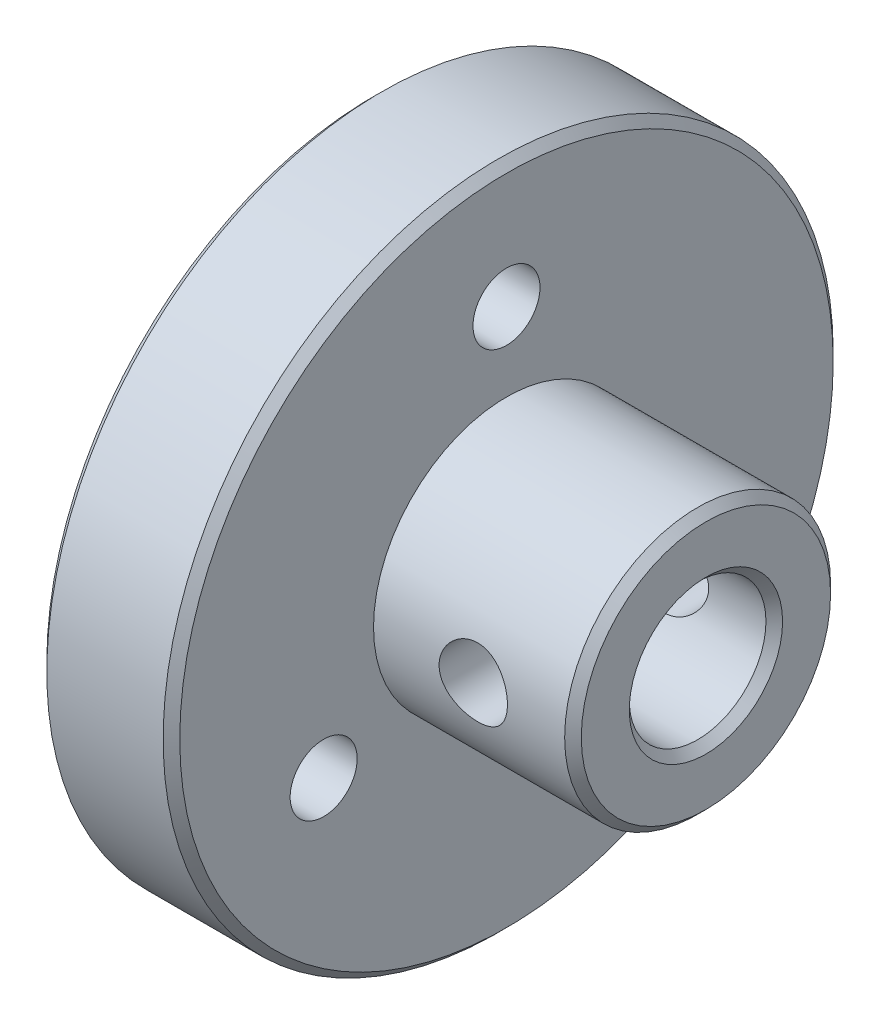
ISO-10303-21;
HEADER;
FILE_DESCRIPTION(('STEP AP214'),'2;1');
FILE_NAME('part.step','',(''),(''),'','','');
FILE_SCHEMA(('AUTOMOTIVE_DESIGN { 1 0 10303 214 1 1 1 1 }'));
ENDSEC;
DATA;
#1=APPLICATION_CONTEXT('core data for automotive mechanical design processes');
#2=APPLICATION_PROTOCOL_DEFINITION('international standard','automotive_design',2000,#1);
#3=PRODUCT_CONTEXT('',#1,'mechanical');
#4=PRODUCT('Part','Part','',(#3));
#5=PRODUCT_RELATED_PRODUCT_CATEGORY('part','',(#4));
#6=PRODUCT_DEFINITION_FORMATION('','',#4);
#7=PRODUCT_DEFINITION_CONTEXT('part definition',#1,'design');
#8=PRODUCT_DEFINITION('design','',#6,#7);
#9=PRODUCT_DEFINITION_SHAPE('','',#8);
#10=(LENGTH_UNIT() NAMED_UNIT(*) SI_UNIT(.MILLI.,.METRE.));
#11=(NAMED_UNIT(*) PLANE_ANGLE_UNIT() SI_UNIT($,.RADIAN.));
#12=(NAMED_UNIT(*) SI_UNIT($,.STERADIAN.) SOLID_ANGLE_UNIT());
#13=UNCERTAINTY_MEASURE_WITH_UNIT(LENGTH_MEASURE(1.E-05),#10,'distance_accuracy_value','');
#14=(GEOMETRIC_REPRESENTATION_CONTEXT(3) GLOBAL_UNCERTAINTY_ASSIGNED_CONTEXT((#13)) GLOBAL_UNIT_ASSIGNED_CONTEXT((#10,
#11,#12)) REPRESENTATION_CONTEXT('',''));
#15=CARTESIAN_POINT('',(0.,0.,0.));
#16=DIRECTION('',(0.,0.,1.));
#17=DIRECTION('',(1.,0.,0.));
#18=AXIS2_PLACEMENT_3D('',#15,#16,#17);
#19=CARTESIAN_POINT('',(0.,0.,0.));
#20=DIRECTION('',(1.,0.,0.));
#21=DIRECTION('',(0.,0.,-1.));
#22=AXIS2_PLACEMENT_3D('',#19,#20,#21);
#23=CYLINDRICAL_SURFACE('',#22,5.);
#24=CARTESIAN_POINT('',(-15.875,0.,0.));
#25=DIRECTION('',(1.,0.,0.));
#26=DIRECTION('',(0.,0.,-1.));
#27=AXIS2_PLACEMENT_3D('',#24,#25,#26);
#28=CIRCLE('',#27,5.);
#29=CARTESIAN_POINT('',(-15.875,0.,-5.));
#30=VERTEX_POINT('',#29);
#31=EDGE_CURVE('E195',#30,#30,#28,.T.);
#32=ORIENTED_EDGE('',*,*,#31,.F.);
#33=EDGE_LOOP('',(#32));
#34=FACE_BOUND('',#33,.T.);
#35=CARTESIAN_POINT('',(-14.0716,0.,0.));
#36=DIRECTION('',(1.,0.,0.));
#37=DIRECTION('',(0.,0.,-1.));
#38=AXIS2_PLACEMENT_3D('',#35,#36,#37);
#39=CIRCLE('',#38,5.);
#40=CARTESIAN_POINT('',(-14.0716,0.,-5.));
#41=VERTEX_POINT('',#40);
#42=EDGE_CURVE('E74',#41,#41,#39,.T.);
#43=ORIENTED_EDGE('',*,*,#42,.T.);
#44=EDGE_LOOP('',(#43));
#45=FACE_BOUND('',#44,.T.);
#46=ADVANCED_FACE('F41',(#34,#45),#23,.F.);
#47=CARTESIAN_POINT('',(-14.0716,0.,0.));
#48=DIRECTION('',(1.,0.,0.));
#49=DIRECTION('',(0.,0.,-1.));
#50=AXIS2_PLACEMENT_3D('',#47,#48,#49);
#51=PLANE('',#50);
#52=ORIENTED_EDGE('',*,*,#42,.F.);
#53=EDGE_LOOP('',(#52));
#54=FACE_BOUND('',#53,.T.);
#55=CARTESIAN_POINT('',(-14.0716,0.,0.));
#56=DIRECTION('',(1.,0.,0.));
#57=DIRECTION('',(0.,0.,-1.));
#58=AXIS2_PLACEMENT_3D('',#55,#56,#57);
#59=CIRCLE('',#58,3.2639);
#60=CARTESIAN_POINT('',(-14.0716,0.,-3.2639));
#61=VERTEX_POINT('',#60);
#62=EDGE_CURVE('E194',#61,#61,#59,.T.);
#63=ORIENTED_EDGE('',*,*,#62,.T.);
#64=EDGE_LOOP('',(#63));
#65=FACE_BOUND('',#64,.T.);
#66=ADVANCED_FACE('F127',(#54,#65),#51,.F.);
#67=CARTESIAN_POINT('',(0.,0.,0.));
#68=DIRECTION('',(1.,0.,0.));
#69=DIRECTION('',(0.,0.,-1.));
#70=AXIS2_PLACEMENT_3D('',#67,#68,#69);
#71=CYLINDRICAL_SURFACE('',#70,3.2639);
#72=CARTESIAN_POINT('',(-0.396875000000003,0.,0.));
#73=DIRECTION('',(1.,0.,0.));
#74=DIRECTION('',(0.,0.,-1.));
#75=AXIS2_PLACEMENT_3D('',#72,#73,#74);
#76=CIRCLE('',#75,3.2639);
#77=CARTESIAN_POINT('',(-0.396875000000003,0.,-3.2639));
#78=VERTEX_POINT('',#77);
#79=EDGE_CURVE('E71',#78,#78,#76,.T.);
#80=ORIENTED_EDGE('',*,*,#79,.T.);
#81=EDGE_LOOP('',(#80));
#82=FACE_BOUND('',#81,.T.);
#83=CARTESIAN_POINT('',(-6.39445,0.,-3.2639));
#84=CARTESIAN_POINT('',(-6.39444461078346,-0.0857948149382654,-3.26389532291357));
#85=CARTESIAN_POINT('',(-6.38764464917009,-0.171691910376437,-3.26048091819691));
#86=CARTESIAN_POINT('',(-6.36074553192663,-0.340947377947075,-3.24715873944838));
#87=CARTESIAN_POINT('',(-6.34062111984722,-0.424300613712308,-3.23723863422405));
#88=CARTESIAN_POINT('',(-6.28805696402809,-0.585761598567648,-3.21194327172338));
#89=CARTESIAN_POINT('',(-6.25566508102653,-0.66388836205654,-3.19658922965782));
#90=CARTESIAN_POINT('',(-6.17973332446341,-0.813482386997529,-3.16183419984897));
#91=CARTESIAN_POINT('',(-6.13619432987307,-0.884950172917077,-3.14243353121231));
#92=CARTESIAN_POINT('',(-6.03620882470249,-1.02406138319655,-3.09999115664244));
#93=CARTESIAN_POINT('',(-5.97914079020487,-1.09121187179073,-3.07680018216184));
#94=CARTESIAN_POINT('',(-5.8550554719428,-1.21544281505067,-3.02987788444172));
#95=CARTESIAN_POINT('',(-5.78803067749997,-1.27251559605109,-3.00614616484334));
#96=CARTESIAN_POINT('',(-5.63970029774532,-1.37940900213483,-2.95870823406511));
#97=CARTESIAN_POINT('',(-5.55769032430439,-1.42832398635349,-2.93514672375907));
#98=CARTESIAN_POINT('',(-5.3853054260373,-1.51146023787427,-2.89321853057488));
#99=CARTESIAN_POINT('',(-5.29493653303091,-1.54569200161431,-2.87484813999227));
#100=CARTESIAN_POINT('',(-5.1139157812067,-1.59626323902967,-2.84706516112352));
#101=CARTESIAN_POINT('',(-5.02360473444862,-1.61355116246243,-2.83718214611041));
#102=CARTESIAN_POINT('',(-4.84086813568578,-1.63264683173037,-2.826241853015));
#103=CARTESIAN_POINT('',(-4.74844476392532,-1.63446987502044,-2.82517585339779));
#104=CARTESIAN_POINT('',(-4.57599092261854,-1.62327991830083,-2.83161162633316));
#105=CARTESIAN_POINT('',(-4.49580015224554,-1.61201501193612,-2.83810406858223));
#106=CARTESIAN_POINT('',(-4.33864682999867,-1.57799748666846,-2.85715651482207));
#107=CARTESIAN_POINT('',(-4.26168531491899,-1.55524120841977,-2.86971845154517));
#108=CARTESIAN_POINT('',(-4.11097801710947,-1.49847245110094,-2.89977077131773));
#109=CARTESIAN_POINT('',(-4.03734889450153,-1.46421012877995,-2.91736913671612));
#110=CARTESIAN_POINT('',(-3.89653136620774,-1.3855935821898,-2.95551700617037));
#111=CARTESIAN_POINT('',(-3.82934587285744,-1.34123482488976,-2.97606783427032));
#112=CARTESIAN_POINT('',(-3.69435404158569,-1.23712589831493,-3.02095418040267));
#113=CARTESIAN_POINT('',(-3.62754915516739,-1.17613732133575,-3.04543918030858));
#114=CARTESIAN_POINT('',(-3.50469833363058,-1.04372272672699,-3.093322438451));
#115=CARTESIAN_POINT('',(-3.44865754036031,-0.972291749466407,-3.11672017329165));
#116=CARTESIAN_POINT('',(-3.34648038548254,-0.816817911692287,-3.16111958146433));
#117=CARTESIAN_POINT('',(-3.30092480899218,-0.732343423810657,-3.18195953203188));
#118=CARTESIAN_POINT('',(-3.22504475345326,-0.555623840366944,-3.21751804095811));
#119=CARTESIAN_POINT('',(-3.1947081803645,-0.463384983186119,-3.23224145831931));
#120=CARTESIAN_POINT('',(-3.15262146490457,-0.281946276065685,-3.25287346449336));
#121=CARTESIAN_POINT('',(-3.13954002782304,-0.193127460778343,-3.25941113060823));
#122=CARTESIAN_POINT('',(-3.12815963202507,-0.0143278681373462,-3.26509154314584));
#123=CARTESIAN_POINT('',(-3.12985367037067,0.075652338576696,-3.26423779278256));
#124=CARTESIAN_POINT('',(-3.14720680516497,0.24680464863253,-3.25559651197993));
#125=CARTESIAN_POINT('',(-3.16177333678871,0.328118900967082,-3.24835152600806));
#126=CARTESIAN_POINT('',(-3.20274432142924,0.486985127892152,-3.22835892477253));
#127=CARTESIAN_POINT('',(-3.22915007952378,0.564536686663568,-3.21561070287443));
#128=CARTESIAN_POINT('',(-3.29374249729539,0.716244264559279,-3.18530939094405));
#129=CARTESIAN_POINT('',(-3.33224441423727,0.79023979639362,-3.16762934003949));
#130=CARTESIAN_POINT('',(-3.41958064279842,0.930964419225125,-3.1291657888731));
#131=CARTESIAN_POINT('',(-3.46841935595296,0.997690396363908,-3.10838096767465));
#132=CARTESIAN_POINT('',(-3.58057722611846,1.12893028053553,-3.06330431809608));
#133=CARTESIAN_POINT('',(-3.64484740415906,1.19258349239676,-3.03886853520349));
#134=CARTESIAN_POINT('',(-3.78320785062769,1.30858942324992,-2.99075059986014));
#135=CARTESIAN_POINT('',(-3.85730485550386,1.36093432491249,-2.96706897833507));
#136=CARTESIAN_POINT('',(-4.01774926142759,1.45522273103403,-2.9220259312138));
#137=CARTESIAN_POINT('',(-4.10451614570289,1.49653975787121,-2.90083240662868));
#138=CARTESIAN_POINT('',(-4.28517105477897,1.56354326778414,-2.86528107280413));
#139=CARTESIAN_POINT('',(-4.37904972741764,1.58924989094918,-2.85091446090985));
#140=CARTESIAN_POINT('',(-4.56162363823669,1.62193258086156,-2.83243691599058));
#141=CARTESIAN_POINT('',(-4.64995134989364,1.63046981548388,-2.82747386945813));
#142=CARTESIAN_POINT('',(-4.82687564125915,1.63307466548424,-2.82597200507364));
#143=CARTESIAN_POINT('',(-4.91547208779175,1.6271485527968,-2.82942953569287));
#144=CARTESIAN_POINT('',(-5.08151930032749,1.602454340662,-2.84347478974254));
#145=CARTESIAN_POINT('',(-5.15922781225271,1.58496340859211,-2.85335188040974));
#146=CARTESIAN_POINT('',(-5.31052206049459,1.53921502585433,-2.8782867986744));
#147=CARTESIAN_POINT('',(-5.38410646187509,1.51095411186843,-2.8933462926332));
#148=CARTESIAN_POINT('',(-5.53053622556748,1.44234310554326,-2.92818390128404));
#149=CARTESIAN_POINT('',(-5.60299978438988,1.40130836335833,-2.94821106164023));
#150=CARTESIAN_POINT('',(-5.740486079321,1.30907027816364,-2.9903089946151));
#151=CARTESIAN_POINT('',(-5.80550491642393,1.25786164485767,-3.01238082723747));
#152=CARTESIAN_POINT('',(-5.93447180810371,1.13943291894503,-3.05929138277848));
#153=CARTESIAN_POINT('',(-5.99732982208056,1.07102336411038,-3.08414043507252));
#154=CARTESIAN_POINT('',(-6.11091987581719,0.923936336032265,-3.13134897800594));
#155=CARTESIAN_POINT('',(-6.16164537952791,0.845253363397916,-3.15370712329019));
#156=CARTESIAN_POINT('',(-6.24959218212796,0.678779569369928,-3.19369366712111));
#157=CARTESIAN_POINT('',(-6.28671546498545,0.590928285188435,-3.21128750673274));
#158=CARTESIAN_POINT('',(-6.3451784393717,0.4091985719523,-3.23944263932882));
#159=CARTESIAN_POINT('',(-6.36656298839458,0.315338107539431,-3.25002391042358));
#160=CARTESIAN_POINT('',(-6.38449088002138,0.183760746575816,-3.258930090697));
#161=CARTESIAN_POINT('',(-6.38822026076182,0.147139679154662,-3.26078893767022));
#162=CARTESIAN_POINT('',(-6.39320101238571,0.0736853687193191,-3.26327491381314));
#163=CARTESIAN_POINT('',(-6.39445231487246,0.0368521198769153,-3.26390200898562));
#164=CARTESIAN_POINT('',(-6.39445,0.,-3.2639));
#165=B_SPLINE_CURVE_WITH_KNOTS('',3,(#83,#84,#85,#86,#87,#88,#89,#90,#91,#92,#93,#94,#95,#96,
#97,#98,#99,#100,#101,#102,#103,#104,#105,#106,#107,#108,#109,#110,#111,#112,#113,#114,#115,
#116,#117,#118,#119,#120,#121,#122,#123,#124,#125,#126,#127,#128,#129,#130,#131,#132,#133,#134,
#135,#136,#137,#138,#139,#140,#141,#142,#143,#144,#145,#146,#147,#148,#149,#150,#151,#152,#153,
#154,#155,#156,#157,#158,#159,#160,#161,#162,#163,#164),.UNSPECIFIED.,.T.,.F.,(4,2,2,2,2,2,2,2,
2,2,2,2,2,2,2,2,2,2,2,2,2,2,2,2,2,2,2,2,2,2,2,2,2,2,2,2,2,2,2,2,4),(0.,0.257234906897046,
0.514958802917925,0.771687394655656,1.02839574908109,1.30063438113998,1.5730794235395,
1.86665258448667,2.16001553072599,2.43581612912248,2.71134388093095,2.95392272366391,
3.19657886266511,3.44488717442963,3.69330719070619,3.97322611009823,4.25327841188326,
4.54633563102856,4.83915959689995,5.10773080884713,5.37617473654503,5.62381241072666,
5.87147738955599,6.12622371394729,6.38107873148752,6.66096076591159,6.94103566540954,
7.23467395553828,7.52793259269378,7.79303953379597,8.05803153346162,8.2977791926962,
8.5376040130615,8.7935415564259,9.04961253408348,9.33679789917566,9.62413763059024,
9.91350897098192,10.2020523362428,10.3125414141455,10.4230335415813),.UNSPECIFIED.);
#166=CARTESIAN_POINT('',(-6.39445,0.,-3.2639));
#167=VERTEX_POINT('',#166);
#168=EDGE_CURVE('E115',#167,#167,#165,.T.);
#169=ORIENTED_EDGE('',*,*,#168,.F.);
#170=EDGE_LOOP('',(#169));
#171=FACE_BOUND('',#170,.T.);
#172=CARTESIAN_POINT('',(-3.13055,0.,3.2639));
#173=CARTESIAN_POINT('',(-3.13055538921654,-0.085794814938266,3.26389532291357));
#174=CARTESIAN_POINT('',(-3.13735535082991,-0.171691910376438,3.26048091819691));
#175=CARTESIAN_POINT('',(-3.16425446807337,-0.340947377947075,3.24715873944838));
#176=CARTESIAN_POINT('',(-3.18437888015279,-0.424300613712308,3.23723863422405));
#177=CARTESIAN_POINT('',(-3.23694303597191,-0.585761598567649,3.21194327172338));
#178=CARTESIAN_POINT('',(-3.26933491897347,-0.66388836205654,3.19658922965782));
#179=CARTESIAN_POINT('',(-3.34526667553659,-0.813482386997529,3.16183419984897));
#180=CARTESIAN_POINT('',(-3.38880567012693,-0.884950172917077,3.14243353121232));
#181=CARTESIAN_POINT('',(-3.48879117529751,-1.02406138319655,3.09999115664244));
#182=CARTESIAN_POINT('',(-3.54585920979513,-1.09121187179073,3.07680018216184));
#183=CARTESIAN_POINT('',(-3.6699445280572,-1.21544281505067,3.02987788444172));
#184=CARTESIAN_POINT('',(-3.73696932250004,-1.27251559605109,3.00614616484334));
#185=CARTESIAN_POINT('',(-3.88529970225468,-1.37940900213483,2.95870823406511));
#186=CARTESIAN_POINT('',(-3.96730967569561,-1.42832398635349,2.93514672375907));
#187=CARTESIAN_POINT('',(-4.1396945739627,-1.51146023787427,2.89321853057488));
#188=CARTESIAN_POINT('',(-4.23006346696909,-1.54569200161431,2.87484813999227));
#189=CARTESIAN_POINT('',(-4.41108421879331,-1.59626323902967,2.84706516112351));
#190=CARTESIAN_POINT('',(-4.50139526555138,-1.61355116246243,2.83718214611041));
#191=CARTESIAN_POINT('',(-4.68413186431422,-1.63264683173037,2.826241853015));
#192=CARTESIAN_POINT('',(-4.77655523607468,-1.63446987502044,2.82517585339779));
#193=CARTESIAN_POINT('',(-4.94900907738147,-1.62327991830083,2.83161162633317));
#194=CARTESIAN_POINT('',(-5.02919984775446,-1.61201501193612,2.83810406858223));
#195=CARTESIAN_POINT('',(-5.18635317000134,-1.57799748666846,2.85715651482207));
#196=CARTESIAN_POINT('',(-5.26331468508101,-1.55524120841977,2.86971845154517));
#197=CARTESIAN_POINT('',(-5.41402198289053,-1.49847245110094,2.89977077131773));
#198=CARTESIAN_POINT('',(-5.48765110549847,-1.46421012877995,2.91736913671612));
#199=CARTESIAN_POINT('',(-5.62846863379226,-1.3855935821898,2.95551700617037));
#200=CARTESIAN_POINT('',(-5.69565412714257,-1.34123482488976,2.97606783427032));
#201=CARTESIAN_POINT('',(-5.83064595841431,-1.23712589831493,3.02095418040267));
#202=CARTESIAN_POINT('',(-5.89745084483261,-1.17613732133575,3.04543918030858));
#203=CARTESIAN_POINT('',(-6.02030166636942,-1.04372272672698,3.093322438451));
#204=CARTESIAN_POINT('',(-6.0763424596397,-0.972291749466405,3.11672017329165));
#205=CARTESIAN_POINT('',(-6.17851961451746,-0.816817911692286,3.16111958146433));
#206=CARTESIAN_POINT('',(-6.22407519100783,-0.732343423810656,3.18195953203188));
#207=CARTESIAN_POINT('',(-6.29995524654674,-0.555623840366942,3.21751804095811));
#208=CARTESIAN_POINT('',(-6.3302918196355,-0.463384983186118,3.23224145831931));
#209=CARTESIAN_POINT('',(-6.37237853509543,-0.281946276065684,3.25287346449336));
#210=CARTESIAN_POINT('',(-6.38545997217696,-0.193127460778342,3.25941113060823));
#211=CARTESIAN_POINT('',(-6.39684036797493,-0.0143278681373452,3.26509154314584));
#212=CARTESIAN_POINT('',(-6.39514632962933,0.0756523385766967,3.26423779278256));
#213=CARTESIAN_POINT('',(-6.37779319483503,0.24680464863253,3.25559651197993));
#214=CARTESIAN_POINT('',(-6.36322666321129,0.328118900967083,3.24835152600806));
#215=CARTESIAN_POINT('',(-6.32225567857076,0.486985127892152,3.22835892477253));
#216=CARTESIAN_POINT('',(-6.29584992047622,0.564536686663568,3.21561070287443));
#217=CARTESIAN_POINT('',(-6.23125750270461,0.716244264559279,3.18530939094405));
#218=CARTESIAN_POINT('',(-6.19275558576273,0.79023979639362,3.16762934003949));
#219=CARTESIAN_POINT('',(-6.10541935720159,0.930964419225125,3.1291657888731));
#220=CARTESIAN_POINT('',(-6.05658064404704,0.997690396363908,3.10838096767465));
#221=CARTESIAN_POINT('',(-5.94442277388154,1.12893028053553,3.06330431809608));
#222=CARTESIAN_POINT('',(-5.88015259584094,1.19258349239676,3.03886853520348));
#223=CARTESIAN_POINT('',(-5.74179214937231,1.30858942324992,2.99075059986014));
#224=CARTESIAN_POINT('',(-5.66769514449614,1.36093432491249,2.96706897833507));
#225=CARTESIAN_POINT('',(-5.50725073857241,1.45522273103403,2.9220259312138));
#226=CARTESIAN_POINT('',(-5.42048385429711,1.49653975787121,2.90083240662868));
#227=CARTESIAN_POINT('',(-5.23982894522103,1.56354326778414,2.86528107280413));
#228=CARTESIAN_POINT('',(-5.14595027258236,1.58924989094918,2.85091446090985));
#229=CARTESIAN_POINT('',(-4.96337636176331,1.62193258086156,2.83243691599058));
#230=CARTESIAN_POINT('',(-4.87504865010636,1.63046981548388,2.82747386945813));
#231=CARTESIAN_POINT('',(-4.69812435874085,1.63307466548424,2.82597200507364));
#232=CARTESIAN_POINT('',(-4.60952791220825,1.6271485527968,2.82942953569287));
#233=CARTESIAN_POINT('',(-4.44348069967251,1.602454340662,2.84347478974254));
#234=CARTESIAN_POINT('',(-4.36577218774729,1.58496340859211,2.85335188040974));
#235=CARTESIAN_POINT('',(-4.21447793950541,1.53921502585433,2.8782867986744));
#236=CARTESIAN_POINT('',(-4.14089353812491,1.51095411186843,2.8933462926332));
#237=CARTESIAN_POINT('',(-3.99446377443252,1.44234310554326,2.92818390128404));
#238=CARTESIAN_POINT('',(-3.92200021561012,1.40130836335833,2.94821106164023));
#239=CARTESIAN_POINT('',(-3.784513920679,1.30907027816364,2.9903089946151));
#240=CARTESIAN_POINT('',(-3.71949508357607,1.25786164485767,3.01238082723747));
#241=CARTESIAN_POINT('',(-3.59052819189629,1.13943291894503,3.05929138277848));
#242=CARTESIAN_POINT('',(-3.52767017791944,1.07102336411038,3.08414043507252));
#243=CARTESIAN_POINT('',(-3.41408012418281,0.923936336032265,3.13134897800594));
#244=CARTESIAN_POINT('',(-3.36335462047209,0.845253363397916,3.15370712329019));
#245=CARTESIAN_POINT('',(-3.27540781787204,0.678779569369928,3.19369366712111));
#246=CARTESIAN_POINT('',(-3.23828453501455,0.590928285188435,3.21128750673274));
#247=CARTESIAN_POINT('',(-3.1798215606283,0.4091985719523,3.23944263932882));
#248=CARTESIAN_POINT('',(-3.15843701160542,0.315338107539431,3.25002391042358));
#249=CARTESIAN_POINT('',(-3.14050911997862,0.183760746575816,3.258930090697));
#250=CARTESIAN_POINT('',(-3.13677973923818,0.147139679154661,3.26078893767022));
#251=CARTESIAN_POINT('',(-3.13179898761429,0.0736853687193187,3.26327491381314));
#252=CARTESIAN_POINT('',(-3.13054768512754,0.0368521198769147,3.26390200898562));
#253=CARTESIAN_POINT('',(-3.13055,0.,3.2639));
#254=B_SPLINE_CURVE_WITH_KNOTS('',3,(#172,#173,#174,#175,#176,#177,#178,#179,#180,#181,#182,
#183,#184,#185,#186,#187,#188,#189,#190,#191,#192,#193,#194,#195,#196,#197,#198,#199,#200,#201,
#202,#203,#204,#205,#206,#207,#208,#209,#210,#211,#212,#213,#214,#215,#216,#217,#218,#219,#220,
#221,#222,#223,#224,#225,#226,#227,#228,#229,#230,#231,#232,#233,#234,#235,#236,#237,#238,#239,
#240,#241,#242,#243,#244,#245,#246,#247,#248,#249,#250,#251,#252,#253),.UNSPECIFIED.,.T.,.F.,(4,
2,2,2,2,2,2,2,2,2,2,2,2,2,2,2,2,2,2,2,2,2,2,2,2,2,2,2,2,2,2,2,2,2,2,2,2,2,2,2,4),(0.,
0.257234906897046,0.514958802917925,0.771687394655656,1.02839574908109,1.30063438113999,
1.5730794235395,1.86665258448667,2.160015530726,2.43581612912248,2.71134388093095,
2.95392272366391,3.19657886266511,3.44488717442963,3.69330719070619,3.97322611009823,
4.25327841188326,4.54633563102856,4.83915959689995,5.10773080884712,5.37617473654503,
5.62381241072666,5.87147738955599,6.12622371394729,6.38107873148752,6.66096076591159,
6.94103566540954,7.23467395553828,7.52793259269378,7.79303953379597,8.05803153346162,
8.2977791926962,8.53760401306149,8.79354155642589,9.04961253408348,9.33679789917566,
9.62413763059024,9.91350897098192,10.2020523362428,10.3125414141455,10.4230335415813),.UNSPECIFIED.);
#255=CARTESIAN_POINT('',(-3.13055,0.,3.2639));
#256=VERTEX_POINT('',#255);
#257=EDGE_CURVE('E83',#256,#256,#254,.T.);
#258=ORIENTED_EDGE('',*,*,#257,.F.);
#259=EDGE_LOOP('',(#258));
#260=FACE_BOUND('',#259,.T.);
#261=ORIENTED_EDGE('',*,*,#62,.F.);
#262=EDGE_LOOP('',(#261));
#263=FACE_BOUND('',#262,.T.);
#264=ADVANCED_FACE('F122',(#82,#171,#260,#263),#71,.F.);
#265=CARTESIAN_POINT('',(0.,0.,0.));
#266=DIRECTION('',(1.,0.,0.));
#267=DIRECTION('',(0.,0.,-1.));
#268=AXIS2_PLACEMENT_3D('',#265,#266,#267);
#269=PLANE('',#268);
#270=CARTESIAN_POINT('',(0.,0.,0.));
#271=DIRECTION('',(1.,0.,0.));
#272=DIRECTION('',(0.,0.,-1.));
#273=AXIS2_PLACEMENT_3D('',#270,#271,#272);
#274=CIRCLE('',#273,3.66077500000001);
#275=CARTESIAN_POINT('',(0.,0.,-3.66077500000001));
#276=VERTEX_POINT('',#275);
#277=EDGE_CURVE('E65',#276,#276,#274,.F.);
#278=ORIENTED_EDGE('',*,*,#277,.T.);
#279=EDGE_LOOP('',(#278));
#280=FACE_BOUND('',#279,.T.);
#281=CARTESIAN_POINT('',(0.,0.,0.));
#282=DIRECTION('',(1.,0.,0.));
#283=DIRECTION('',(0.,0.,-1.));
#284=AXIS2_PLACEMENT_3D('',#281,#282,#283);
#285=CIRCLE('',#284,5.953125);
#286=CARTESIAN_POINT('',(0.,0.,-5.953125));
#287=VERTEX_POINT('',#286);
#288=EDGE_CURVE('E68',#287,#287,#285,.T.);
#289=ORIENTED_EDGE('',*,*,#288,.T.);
#290=EDGE_LOOP('',(#289));
#291=FACE_BOUND('',#290,.T.);
#292=ADVANCED_FACE('F126',(#280,#291),#269,.T.);
#293=CARTESIAN_POINT('',(0.,0.,0.));
#294=DIRECTION('',(1.,0.,0.));
#295=DIRECTION('',(0.,0.,-1.));
#296=AXIS2_PLACEMENT_3D('',#293,#294,#295);
#297=CYLINDRICAL_SURFACE('',#296,6.35);
#298=CARTESIAN_POINT('',(-0.396875000000002,0.,0.));
#299=DIRECTION('',(1.,0.,0.));
#300=DIRECTION('',(0.,0.,-1.));
#301=AXIS2_PLACEMENT_3D('',#298,#299,#300);
#302=CIRCLE('',#301,6.35);
#303=CARTESIAN_POINT('',(-0.396875000000002,0.,-6.35));
#304=VERTEX_POINT('',#303);
#305=EDGE_CURVE('E62',#304,#304,#302,.F.);
#306=ORIENTED_EDGE('',*,*,#305,.T.);
#307=EDGE_LOOP('',(#306));
#308=FACE_BOUND('',#307,.T.);
#309=CARTESIAN_POINT('',(-6.39445,0.,-6.35));
#310=CARTESIAN_POINT('',(-6.39444762637792,0.0900832427805274,-6.34999853742925));
#311=CARTESIAN_POINT('',(-6.38696608194418,0.180192538242263,-6.34806407067829));
#312=CARTESIAN_POINT('',(-6.35728575347209,0.357823110530569,-6.34053471632414));
#313=CARTESIAN_POINT('',(-6.33507914888526,0.445342986288113,-6.33493788364205));
#314=CARTESIAN_POINT('',(-6.27671246984148,0.615204383991936,-6.32070272738092));
#315=CARTESIAN_POINT('',(-6.24056966413996,0.69755216855013,-6.31206816909213));
#316=CARTESIAN_POINT('',(-6.1554186551762,0.855016438842545,-6.2926742209998));
#317=CARTESIAN_POINT('',(-6.10640984095822,0.930132580943155,-6.28191473029766));
#318=CARTESIAN_POINT('',(-5.99579644478831,1.0726290069813,-6.25917566113133));
#319=CARTESIAN_POINT('',(-5.93396526146045,1.13983025842973,-6.24717641076734));
#320=CARTESIAN_POINT('',(-5.79994712873682,1.26303246398187,-6.22343908090652));
#321=CARTESIAN_POINT('',(-5.72775894598779,1.31903208224567,-6.21170103270728));
#322=CARTESIAN_POINT('',(-5.57366980174808,1.41909613118511,-6.18961562360334));
#323=CARTESIAN_POINT('',(-5.49163336574906,1.4629579440714,-6.1792931738242));
#324=CARTESIAN_POINT('',(-5.32104287110121,1.53619745709313,-6.16149557285909));
#325=CARTESIAN_POINT('',(-5.23248992277704,1.56557761816719,-6.15401993794894));
#326=CARTESIAN_POINT('',(-5.05335464650456,1.60840452107314,-6.14296495248279));
#327=CARTESIAN_POINT('',(-4.96285452861497,1.62217428976425,-6.13930673998653));
#328=CARTESIAN_POINT('',(-4.78076053038199,1.63439609439818,-6.13606491945883));
#329=CARTESIAN_POINT('',(-4.68916684151525,1.63285077373329,-6.13648060826979));
#330=CARTESIAN_POINT('',(-4.5099801000851,1.61474346585546,-6.14126886051886));
#331=CARTESIAN_POINT('',(-4.42234474710117,1.59856883637377,-6.14553935000847));
#332=CARTESIAN_POINT('',(-4.25107521667245,1.55228099377883,-6.15739303880302));
#333=CARTESIAN_POINT('',(-4.16744133916703,1.52216673759067,-6.16497648600769));
#334=CARTESIAN_POINT('',(-4.00552212322514,1.44853037205355,-6.18269368611742));
#335=CARTESIAN_POINT('',(-3.92730279880293,1.40486966226613,-6.19285359414425));
#336=CARTESIAN_POINT('',(-3.77916306134906,1.30547658744672,-6.21456447758282));
#337=CARTESIAN_POINT('',(-3.70924417962549,1.24974200030496,-6.22611570888355));
#338=CARTESIAN_POINT('',(-3.5774729814527,1.12578747497308,-6.24973547270209));
#339=CARTESIAN_POINT('',(-3.51592805054838,1.05724130656327,-6.26180909243688));
#340=CARTESIAN_POINT('',(-3.40514654864413,0.910654960274706,-6.28479938490686));
#341=CARTESIAN_POINT('',(-3.35591039685002,0.832614459177575,-6.29571601823074));
#342=CARTESIAN_POINT('',(-3.27102201198631,0.668800723785404,-6.31522179298351));
#343=CARTESIAN_POINT('',(-3.23542205528143,0.582999259374197,-6.32380194154541));
#344=CARTESIAN_POINT('',(-3.17923828603586,0.406359330465465,-6.33760278252931));
#345=CARTESIAN_POINT('',(-3.15865143296271,0.315521889892354,-6.34282415516297));
#346=CARTESIAN_POINT('',(-3.13355313376445,0.134014651929872,-6.34921756402901));
#347=CARTESIAN_POINT('',(-3.12862337636288,0.0434063219199569,-6.35049494547236));
#348=CARTESIAN_POINT('',(-3.13382862892845,-0.137341366050992,-6.34915765638517));
#349=CARTESIAN_POINT('',(-3.14396220039558,-0.227480767968279,-6.34654335749771));
#350=CARTESIAN_POINT('',(-3.17866231897643,-0.403261999033139,-6.33778418809177));
#351=CARTESIAN_POINT('',(-3.20299854758123,-0.488952359205922,-6.33169569146024));
#352=CARTESIAN_POINT('',(-3.26514828237445,-0.655028369337658,-6.31667606522243));
#353=CARTESIAN_POINT('',(-3.30296319278092,-0.735413465556163,-6.30774463944826));
#354=CARTESIAN_POINT('',(-3.39179315112612,-0.890245404055785,-6.28777978474646));
#355=CARTESIAN_POINT('',(-3.44303971893975,-0.9645546808164,-6.27671048658936));
#356=CARTESIAN_POINT('',(-3.55698439286952,-1.10366677132267,-6.25375079898621));
#357=CARTESIAN_POINT('',(-3.61968459338764,-1.16846784249122,-6.24186025961637));
#358=CARTESIAN_POINT('',(-3.75670326411839,-1.28846407642616,-6.21821551880735));
#359=CARTESIAN_POINT('',(-3.83128182063417,-1.34336506392226,-6.20647293601066));
#360=CARTESIAN_POINT('',(-3.98883792932157,-1.43987523169588,-6.18479711433305));
#361=CARTESIAN_POINT('',(-4.07181511506702,-1.4814849915312,-6.1748637965681));
#362=CARTESIAN_POINT('',(-4.24337824745287,-1.54991921139586,-6.1580429371817));
#363=CARTESIAN_POINT('',(-4.33192757044606,-1.57683085045272,-6.15113748563594));
#364=CARTESIAN_POINT('',(-4.51250006405821,-1.61532586051625,-6.14114202499482));
#365=CARTESIAN_POINT('',(-4.60452241776081,-1.62691281332369,-6.13805112434527));
#366=CARTESIAN_POINT('',(-4.78642789345305,-1.63423447814553,-6.13610540412872));
#367=CARTESIAN_POINT('',(-4.8762909964078,-1.63044042646387,-6.13712465446063));
#368=CARTESIAN_POINT('',(-5.05404985242771,-1.60819231070976,-6.14299171402866));
#369=CARTESIAN_POINT('',(-5.14194564942399,-1.58973857433329,-6.14783943768479));
#370=CARTESIAN_POINT('',(-5.31272919110616,-1.53895895352979,-6.16074504271276));
#371=CARTESIAN_POINT('',(-5.39564636800799,-1.50672619247723,-6.16878134881541));
#372=CARTESIAN_POINT('',(-5.55495675354476,-1.4293764880601,-6.18716058430811));
#373=CARTESIAN_POINT('',(-5.6313490051317,-1.38425765882378,-6.19750385127255));
#374=CARTESIAN_POINT('',(-5.77770678184639,-1.28095957079085,-6.21968660164458));
#375=CARTESIAN_POINT('',(-5.8474380811558,-1.22245555087478,-6.23155938439662));
#376=CARTESIAN_POINT('',(-5.97624676615527,-1.09467439444028,-6.25527002954186));
#377=CARTESIAN_POINT('',(-6.03532159496622,-1.0253946798424,-6.26710788288579));
#378=CARTESIAN_POINT('',(-6.14226408483933,-0.876403289245227,-6.2896897308089));
#379=CARTESIAN_POINT('',(-6.18989155331139,-0.796514997623781,-6.30040798708012));
#380=CARTESIAN_POINT('',(-6.27096476545169,-0.629595411795352,-6.31926748959082));
#381=CARTESIAN_POINT('',(-6.30442023725974,-0.54256906652993,-6.32741050258849));
#382=CARTESIAN_POINT('',(-6.35148078427107,-0.379804365627809,-6.33906002243851));
#383=CARTESIAN_POINT('',(-6.36755835573315,-0.304811931935723,-6.34313363351014));
#384=CARTESIAN_POINT('',(-6.38904352279087,-0.153219190265881,-6.3486041313279));
#385=CARTESIAN_POINT('',(-6.39445201885043,-0.0766190185318488,-6.35000124396871));
#386=CARTESIAN_POINT('',(-6.39445,0.,-6.35));
#387=B_SPLINE_CURVE_WITH_KNOTS('',3,(#309,#310,#311,#312,#313,#314,#315,#316,#317,#318,#319,
#320,#321,#322,#323,#324,#325,#326,#327,#328,#329,#330,#331,#332,#333,#334,#335,#336,#337,#338,
#339,#340,#341,#342,#343,#344,#345,#346,#347,#348,#349,#350,#351,#352,#353,#354,#355,#356,#357,
#358,#359,#360,#361,#362,#363,#364,#365,#366,#367,#368,#369,#370,#371,#372,#373,#374,#375,#376,
#377,#378,#379,#380,#381,#382,#383,#384,#385,#386),.UNSPECIFIED.,.T.,.F.,(4,2,2,2,2,2,2,2,2,2,2,
2,2,2,2,2,2,2,2,2,2,2,2,2,2,2,2,2,2,2,2,2,2,2,2,2,2,2,4),(0.,0.269968865450127,
0.540081227595176,0.809859955658463,1.07965149676235,1.35469436668117,1.62977001704168,
1.90919310870943,2.18856870024639,2.46205113892505,2.73548637521662,3.00188692260077,
3.26830740743825,3.53754904591458,3.80684027852791,4.08426424784534,4.3616976642329,
4.64018426428514,4.91861444809582,5.18954035534875,5.46044039170126,5.72706483939969,
5.9937170723336,6.26530823521989,6.53694911085001,6.81566554470132,7.09436982359229,
7.37140255610559,7.6483705269984,7.91691800634807,8.18545948287719,8.45221406446853,
8.71900770552551,8.99313112168831,9.26732022290683,9.54683956163013,9.82616671664174,
10.0558042704161,10.2854224420814),.UNSPECIFIED.);
#388=CARTESIAN_POINT('',(-6.39445,0.,-6.35));
#389=VERTEX_POINT('',#388);
#390=EDGE_CURVE('E75',#389,#389,#387,.T.);
#391=ORIENTED_EDGE('',*,*,#390,.F.);
#392=EDGE_LOOP('',(#391));
#393=FACE_BOUND('',#392,.T.);
#394=CARTESIAN_POINT('',(-3.13055,0.,6.35));
#395=CARTESIAN_POINT('',(-3.13055237362208,0.0900832427805269,6.34999853742925));
#396=CARTESIAN_POINT('',(-3.13803391805582,0.180192538242263,6.34806407067829));
#397=CARTESIAN_POINT('',(-3.16771424652791,0.357823110530569,6.34053471632414));
#398=CARTESIAN_POINT('',(-3.18992085111474,0.445342986288113,6.33493788364205));
#399=CARTESIAN_POINT('',(-3.24828753015852,0.615204383991935,6.32070272738092));
#400=CARTESIAN_POINT('',(-3.28443033586004,0.69755216855013,6.31206816909213));
#401=CARTESIAN_POINT('',(-3.3695813448238,0.855016438842544,6.2926742209998));
#402=CARTESIAN_POINT('',(-3.41859015904178,0.930132580943155,6.28191473029766));
#403=CARTESIAN_POINT('',(-3.52920355521169,1.0726290069813,6.25917566113133));
#404=CARTESIAN_POINT('',(-3.59103473853955,1.13983025842973,6.24717641076734));
#405=CARTESIAN_POINT('',(-3.72505287126318,1.26303246398187,6.22343908090652));
#406=CARTESIAN_POINT('',(-3.79724105401221,1.31903208224567,6.21170103270728));
#407=CARTESIAN_POINT('',(-3.95133019825192,1.41909613118511,6.18961562360334));
#408=CARTESIAN_POINT('',(-4.03336663425094,1.4629579440714,6.1792931738242));
#409=CARTESIAN_POINT('',(-4.20395712889879,1.53619745709313,6.16149557285909));
#410=CARTESIAN_POINT('',(-4.29251007722296,1.56557761816719,6.15401993794894));
#411=CARTESIAN_POINT('',(-4.47164535349545,1.60840452107314,6.14296495248279));
#412=CARTESIAN_POINT('',(-4.56214547138503,1.62217428976425,6.13930673998653));
#413=CARTESIAN_POINT('',(-4.74423946961801,1.63439609439818,6.13606491945883));
#414=CARTESIAN_POINT('',(-4.83583315848475,1.63285077373329,6.13648060826979));
#415=CARTESIAN_POINT('',(-5.0150198999149,1.61474346585546,6.14126886051886));
#416=CARTESIAN_POINT('',(-5.10265525289883,1.59856883637377,6.14553935000847));
#417=CARTESIAN_POINT('',(-5.27392478332755,1.55228099377883,6.15739303880302));
#418=CARTESIAN_POINT('',(-5.35755866083297,1.52216673759067,6.16497648600769));
#419=CARTESIAN_POINT('',(-5.51947787677486,1.44853037205355,6.18269368611742));
#420=CARTESIAN_POINT('',(-5.59769720119707,1.40486966226613,6.19285359414425));
#421=CARTESIAN_POINT('',(-5.74583693865094,1.30547658744672,6.21456447758282));
#422=CARTESIAN_POINT('',(-5.81575582037451,1.24974200030496,6.22611570888355));
#423=CARTESIAN_POINT('',(-5.9475270185473,1.12578747497308,6.24973547270209));
#424=CARTESIAN_POINT('',(-6.00907194945162,1.05724130656327,6.26180909243688));
#425=CARTESIAN_POINT('',(-6.11985345135587,0.910654960274706,6.28479938490686));
#426=CARTESIAN_POINT('',(-6.16908960314998,0.832614459177576,6.29571601823074));
#427=CARTESIAN_POINT('',(-6.25397798801369,0.668800723785404,6.31522179298351));
#428=CARTESIAN_POINT('',(-6.28957794471857,0.582999259374197,6.32380194154541));
#429=CARTESIAN_POINT('',(-6.34576171396414,0.406359330465465,6.33760278252931));
#430=CARTESIAN_POINT('',(-6.36634856703729,0.315521889892355,6.34282415516297));
#431=CARTESIAN_POINT('',(-6.39144686623555,0.134014651929872,6.34921756402901));
#432=CARTESIAN_POINT('',(-6.39637662363712,0.0434063219199574,6.35049494547236));
#433=CARTESIAN_POINT('',(-6.39117137107155,-0.137341366050992,6.34915765638517));
#434=CARTESIAN_POINT('',(-6.38103779960442,-0.227480767968279,6.34654335749771));
#435=CARTESIAN_POINT('',(-6.34633768102357,-0.403261999033138,6.33778418809177));
#436=CARTESIAN_POINT('',(-6.32200145241877,-0.488952359205922,6.33169569146024));
#437=CARTESIAN_POINT('',(-6.25985171762555,-0.655028369337658,6.31667606522243));
#438=CARTESIAN_POINT('',(-6.22203680721908,-0.735413465556163,6.30774463944826));
#439=CARTESIAN_POINT('',(-6.13320684887388,-0.890245404055785,6.28777978474646));
#440=CARTESIAN_POINT('',(-6.08196028106025,-0.9645546808164,6.27671048658936));
#441=CARTESIAN_POINT('',(-5.96801560713048,-1.10366677132267,6.25375079898621));
#442=CARTESIAN_POINT('',(-5.90531540661236,-1.16846784249122,6.24186025961637));
#443=CARTESIAN_POINT('',(-5.76829673588161,-1.28846407642616,6.21821551880735));
#444=CARTESIAN_POINT('',(-5.69371817936583,-1.34336506392226,6.20647293601066));
#445=CARTESIAN_POINT('',(-5.53616207067843,-1.43987523169588,6.18479711433305));
#446=CARTESIAN_POINT('',(-5.45318488493298,-1.4814849915312,6.1748637965681));
#447=CARTESIAN_POINT('',(-5.28162175254714,-1.54991921139586,6.1580429371817));
#448=CARTESIAN_POINT('',(-5.19307242955394,-1.57683085045272,6.15113748563594));
#449=CARTESIAN_POINT('',(-5.01249993594179,-1.61532586051625,6.14114202499482));
#450=CARTESIAN_POINT('',(-4.92047758223919,-1.62691281332369,6.13805112434527));
#451=CARTESIAN_POINT('',(-4.73857210654695,-1.63423447814553,6.13610540412872));
#452=CARTESIAN_POINT('',(-4.6487090035922,-1.63044042646387,6.13712465446063));
#453=CARTESIAN_POINT('',(-4.47095014757229,-1.60819231070976,6.14299171402866));
#454=CARTESIAN_POINT('',(-4.38305435057602,-1.58973857433329,6.14783943768479));
#455=CARTESIAN_POINT('',(-4.21227080889384,-1.53895895352979,6.16074504271276));
#456=CARTESIAN_POINT('',(-4.12935363199201,-1.50672619247723,6.16878134881541));
#457=CARTESIAN_POINT('',(-3.97004324645524,-1.4293764880601,6.18716058430811));
#458=CARTESIAN_POINT('',(-3.8936509948683,-1.38425765882378,6.19750385127255));
#459=CARTESIAN_POINT('',(-3.74729321815361,-1.28095957079085,6.21968660164458));
#460=CARTESIAN_POINT('',(-3.6775619188442,-1.22245555087478,6.23155938439662));
#461=CARTESIAN_POINT('',(-3.54875323384473,-1.09467439444028,6.25527002954186));
#462=CARTESIAN_POINT('',(-3.48967840503378,-1.0253946798424,6.26710788288579));
#463=CARTESIAN_POINT('',(-3.38273591516067,-0.876403289245227,6.2896897308089));
#464=CARTESIAN_POINT('',(-3.33510844668861,-0.79651499762378,6.30040798708012));
#465=CARTESIAN_POINT('',(-3.25403523454831,-0.629595411795351,6.31926748959082));
#466=CARTESIAN_POINT('',(-3.22057976274026,-0.54256906652993,6.32741050258849));
#467=CARTESIAN_POINT('',(-3.17351921572893,-0.379804365627809,6.33906002243851));
#468=CARTESIAN_POINT('',(-3.15744164426685,-0.304811931935724,6.34313363351014));
#469=CARTESIAN_POINT('',(-3.13595647720913,-0.153219190265882,6.3486041313279));
#470=CARTESIAN_POINT('',(-3.13054798114957,-0.0766190185318494,6.35000124396871));
#471=CARTESIAN_POINT('',(-3.13055,0.,6.35));
#472=B_SPLINE_CURVE_WITH_KNOTS('',3,(#394,#395,#396,#397,#398,#399,#400,#401,#402,#403,#404,
#405,#406,#407,#408,#409,#410,#411,#412,#413,#414,#415,#416,#417,#418,#419,#420,#421,#422,#423,
#424,#425,#426,#427,#428,#429,#430,#431,#432,#433,#434,#435,#436,#437,#438,#439,#440,#441,#442,
#443,#444,#445,#446,#447,#448,#449,#450,#451,#452,#453,#454,#455,#456,#457,#458,#459,#460,#461,
#462,#463,#464,#465,#466,#467,#468,#469,#470,#471),.UNSPECIFIED.,.T.,.F.,(4,2,2,2,2,2,2,2,2,2,2,
2,2,2,2,2,2,2,2,2,2,2,2,2,2,2,2,2,2,2,2,2,2,2,2,2,2,2,4),(0.,0.269968865450127,
0.540081227595176,0.809859955658463,1.07965149676235,1.35469436668117,1.62977001704167,
1.90919310870943,2.1885687002464,2.46205113892505,2.73548637521662,3.00188692260077,
3.26830740743825,3.53754904591458,3.80684027852791,4.08426424784534,4.3616976642329,
4.64018426428514,4.91861444809582,5.18954035534875,5.46044039170126,5.72706483939969,
5.9937170723336,6.26530823521989,6.53694911085001,6.81566554470132,7.09436982359229,
7.37140255610559,7.6483705269984,7.91691800634807,8.18545948287719,8.45221406446853,
8.71900770552551,8.99313112168831,9.26732022290683,9.54683956163013,9.82616671664174,
10.0558042704161,10.2854224420814),.UNSPECIFIED.);
#473=CARTESIAN_POINT('',(-3.13055,0.,6.35));
#474=VERTEX_POINT('',#473);
#475=EDGE_CURVE('E84',#474,#474,#472,.T.);
#476=ORIENTED_EDGE('',*,*,#475,.F.);
#477=EDGE_LOOP('',(#476));
#478=FACE_BOUND('',#477,.T.);
#479=CARTESIAN_POINT('',(-9.525,0.,0.));
#480=DIRECTION('',(1.,0.,0.));
#481=DIRECTION('',(0.,0.,-1.));
#482=AXIS2_PLACEMENT_3D('',#479,#480,#481);
#483=CIRCLE('',#482,6.35);
#484=CARTESIAN_POINT('',(-9.525,0.,-6.35));
#485=VERTEX_POINT('',#484);
#486=EDGE_CURVE('E192',#485,#485,#483,.T.);
#487=ORIENTED_EDGE('',*,*,#486,.T.);
#488=EDGE_LOOP('',(#487));
#489=FACE_BOUND('',#488,.T.);
#490=ADVANCED_FACE('F89',(#308,#393,#478,#489),#297,.T.);
#491=CARTESIAN_POINT('',(-9.525,0.,0.));
#492=DIRECTION('',(1.,0.,0.));
#493=DIRECTION('',(0.,0.,-1.));
#494=AXIS2_PLACEMENT_3D('',#491,#492,#493);
#495=PLANE('',#494);
#496=CARTESIAN_POINT('',(-9.525,0.,0.));
#497=DIRECTION('',(1.,0.,0.));
#498=DIRECTION('',(0.,0.,-1.));
#499=AXIS2_PLACEMENT_3D('',#496,#497,#498);
#500=CIRCLE('',#499,15.603125);
#501=CARTESIAN_POINT('',(-9.525,0.,-15.603125));
#502=VERTEX_POINT('',#501);
#503=EDGE_CURVE('E10',#502,#502,#500,.T.);
#504=ORIENTED_EDGE('',*,*,#503,.T.);
#505=EDGE_LOOP('',(#504));
#506=FACE_BOUND('',#505,.T.);
#507=CARTESIAN_POINT('',(-9.525,-5.04124934548305,8.7317));
#508=DIRECTION('',(1.,0.,0.));
#509=DIRECTION('',(0.,0.,-1.));
#510=AXIS2_PLACEMENT_3D('',#507,#508,#509);
#511=CIRCLE('',#510,1.6);
#512=CARTESIAN_POINT('',(-9.525,-5.04124934548305,7.1317));
#513=VERTEX_POINT('',#512);
#514=EDGE_CURVE('E181',#513,#513,#511,.T.);
#515=ORIENTED_EDGE('',*,*,#514,.F.);
#516=EDGE_LOOP('',(#515));
#517=FACE_BOUND('',#516,.T.);
#518=CARTESIAN_POINT('',(-9.525,10.0824986909661,0.));
#519=DIRECTION('',(1.,0.,0.));
#520=DIRECTION('',(0.,0.,-1.));
#521=AXIS2_PLACEMENT_3D('',#518,#519,#520);
#522=CIRCLE('',#521,1.6);
#523=CARTESIAN_POINT('',(-9.525,10.0824986909661,-1.6));
#524=VERTEX_POINT('',#523);
#525=EDGE_CURVE('E185',#524,#524,#522,.T.);
#526=ORIENTED_EDGE('',*,*,#525,.F.);
#527=EDGE_LOOP('',(#526));
#528=FACE_BOUND('',#527,.T.);
#529=CARTESIAN_POINT('',(-9.525,-5.04124934548306,-8.7317));
#530=DIRECTION('',(1.,0.,0.));
#531=DIRECTION('',(0.,0.,-1.));
#532=AXIS2_PLACEMENT_3D('',#529,#530,#531);
#533=CIRCLE('',#532,1.6);
#534=CARTESIAN_POINT('',(-9.525,-5.04124934548306,-10.3317));
#535=VERTEX_POINT('',#534);
#536=EDGE_CURVE('E189',#535,#535,#533,.T.);
#537=ORIENTED_EDGE('',*,*,#536,.F.);
#538=EDGE_LOOP('',(#537));
#539=FACE_BOUND('',#538,.T.);
#540=ORIENTED_EDGE('',*,*,#486,.F.);
#541=EDGE_LOOP('',(#540));
#542=FACE_BOUND('',#541,.T.);
#543=ADVANCED_FACE('F166',(#506,#517,#528,#539,#542),#495,.T.);
#544=CARTESIAN_POINT('',(0.,0.,0.));
#545=DIRECTION('',(1.,0.,0.));
#546=DIRECTION('',(0.,0.,-1.));
#547=AXIS2_PLACEMENT_3D('',#544,#545,#546);
#548=CYLINDRICAL_SURFACE('',#547,16.);
#549=CARTESIAN_POINT('',(-15.478125,0.,0.));
#550=DIRECTION('',(1.,0.,0.));
#551=DIRECTION('',(0.,0.,-1.));
#552=AXIS2_PLACEMENT_3D('',#549,#550,#551);
#553=CIRCLE('',#552,16.);
#554=CARTESIAN_POINT('',(-15.478125,0.,-16.));
#555=VERTEX_POINT('',#554);
#556=EDGE_CURVE('E53',#555,#555,#553,.T.);
#557=ORIENTED_EDGE('',*,*,#556,.T.);
#558=EDGE_LOOP('',(#557));
#559=FACE_BOUND('',#558,.T.);
#560=CARTESIAN_POINT('',(-9.921875,0.,0.));
#561=DIRECTION('',(1.,0.,0.));
#562=DIRECTION('',(0.,0.,-1.));
#563=AXIS2_PLACEMENT_3D('',#560,#561,#562);
#564=CIRCLE('',#563,16.);
#565=CARTESIAN_POINT('',(-9.921875,0.,-16.));
#566=VERTEX_POINT('',#565);
#567=EDGE_CURVE('E57',#566,#566,#564,.F.);
#568=ORIENTED_EDGE('',*,*,#567,.T.);
#569=EDGE_LOOP('',(#568));
#570=FACE_BOUND('',#569,.T.);
#571=ADVANCED_FACE('F163',(#559,#570),#548,.T.);
#572=CARTESIAN_POINT('',(-15.875,0.,0.));
#573=DIRECTION('',(1.,0.,0.));
#574=DIRECTION('',(0.,0.,-1.));
#575=AXIS2_PLACEMENT_3D('',#572,#573,#574);
#576=PLANE('',#575);
#577=CARTESIAN_POINT('',(-15.875,0.,0.));
#578=DIRECTION('',(1.,0.,0.));
#579=DIRECTION('',(0.,0.,-1.));
#580=AXIS2_PLACEMENT_3D('',#577,#578,#579);
#581=CIRCLE('',#580,15.603125);
#582=CARTESIAN_POINT('',(-15.875,0.,-15.603125));
#583=VERTEX_POINT('',#582);
#584=EDGE_CURVE('E49',#583,#583,#581,.F.);
#585=ORIENTED_EDGE('',*,*,#584,.T.);
#586=EDGE_LOOP('',(#585));
#587=FACE_BOUND('',#586,.T.);
#588=CARTESIAN_POINT('',(-15.875,-5.04124934548305,8.7317));
#589=DIRECTION('',(1.,0.,0.));
#590=DIRECTION('',(0.,0.,-1.));
#591=AXIS2_PLACEMENT_3D('',#588,#589,#590);
#592=CIRCLE('',#591,1.6);
#593=CARTESIAN_POINT('',(-15.875,-5.04124934548305,7.1317));
#594=VERTEX_POINT('',#593);
#595=EDGE_CURVE('E219',#594,#594,#592,.T.);
#596=ORIENTED_EDGE('',*,*,#595,.T.);
#597=EDGE_LOOP('',(#596));
#598=FACE_BOUND('',#597,.T.);
#599=CARTESIAN_POINT('',(-15.875,10.0824986909661,0.));
#600=DIRECTION('',(1.,0.,0.));
#601=DIRECTION('',(0.,0.,-1.));
#602=AXIS2_PLACEMENT_3D('',#599,#600,#601);
#603=CIRCLE('',#602,1.6);
#604=CARTESIAN_POINT('',(-15.875,10.0824986909661,-1.6));
#605=VERTEX_POINT('',#604);
#606=EDGE_CURVE('E227',#605,#605,#603,.T.);
#607=ORIENTED_EDGE('',*,*,#606,.T.);
#608=EDGE_LOOP('',(#607));
#609=FACE_BOUND('',#608,.T.);
#610=CARTESIAN_POINT('',(-15.875,-5.04124934548306,-8.7317));
#611=DIRECTION('',(1.,0.,0.));
#612=DIRECTION('',(0.,0.,-1.));
#613=AXIS2_PLACEMENT_3D('',#610,#611,#612);
#614=CIRCLE('',#613,1.6);
#615=CARTESIAN_POINT('',(-15.875,-5.04124934548306,-10.3317));
#616=VERTEX_POINT('',#615);
#617=EDGE_CURVE('E116',#616,#616,#614,.T.);
#618=ORIENTED_EDGE('',*,*,#617,.T.);
#619=EDGE_LOOP('',(#618));
#620=FACE_BOUND('',#619,.T.);
#621=ORIENTED_EDGE('',*,*,#31,.T.);
#622=EDGE_LOOP('',(#621));
#623=FACE_BOUND('',#622,.T.);
#624=ADVANCED_FACE('F99',(#587,#598,#609,#620,#623),#576,.F.);
#625=CARTESIAN_POINT('',(-4.7625,0.,-16.));
#626=DIRECTION('',(0.,0.,1.));
#627=DIRECTION('',(1.,0.,0.));
#628=AXIS2_PLACEMENT_3D('',#625,#626,#627);
#629=CYLINDRICAL_SURFACE('',#628,1.63195);
#630=ORIENTED_EDGE('',*,*,#257,.T.);
#631=EDGE_LOOP('',(#630));
#632=FACE_BOUND('',#631,.T.);
#633=ORIENTED_EDGE('',*,*,#475,.T.);
#634=EDGE_LOOP('',(#633));
#635=FACE_BOUND('',#634,.T.);
#636=ADVANCED_FACE('F93',(#632,#635),#629,.F.);
#637=ORIENTED_EDGE('',*,*,#168,.T.);
#638=EDGE_LOOP('',(#637));
#639=FACE_BOUND('',#638,.T.);
#640=ORIENTED_EDGE('',*,*,#390,.T.);
#641=EDGE_LOOP('',(#640));
#642=FACE_BOUND('',#641,.T.);
#643=ADVANCED_FACE('F98',(#639,#642),#629,.F.);
#644=CARTESIAN_POINT('',(-15.875,-5.04124934548306,-8.7317));
#645=DIRECTION('',(1.,0.,0.));
#646=DIRECTION('',(0.,0.,-1.));
#647=AXIS2_PLACEMENT_3D('',#644,#645,#646);
#648=CYLINDRICAL_SURFACE('',#647,1.6);
#649=ORIENTED_EDGE('',*,*,#617,.F.);
#650=EDGE_LOOP('',(#649));
#651=FACE_BOUND('',#650,.T.);
#652=ORIENTED_EDGE('',*,*,#536,.T.);
#653=EDGE_LOOP('',(#652));
#654=FACE_BOUND('',#653,.T.);
#655=ADVANCED_FACE('F101',(#651,#654),#648,.F.);
#656=CARTESIAN_POINT('',(-15.875,10.0824986909661,0.));
#657=DIRECTION('',(1.,0.,0.));
#658=DIRECTION('',(0.,0.,-1.));
#659=AXIS2_PLACEMENT_3D('',#656,#657,#658);
#660=CYLINDRICAL_SURFACE('',#659,1.6);
#661=ORIENTED_EDGE('',*,*,#606,.F.);
#662=EDGE_LOOP('',(#661));
#663=FACE_BOUND('',#662,.T.);
#664=ORIENTED_EDGE('',*,*,#525,.T.);
#665=EDGE_LOOP('',(#664));
#666=FACE_BOUND('',#665,.T.);
#667=ADVANCED_FACE('F235',(#663,#666),#660,.F.);
#668=CARTESIAN_POINT('',(-15.875,-5.04124934548305,8.7317));
#669=DIRECTION('',(1.,0.,0.));
#670=DIRECTION('',(0.,0.,-1.));
#671=AXIS2_PLACEMENT_3D('',#668,#669,#670);
#672=CYLINDRICAL_SURFACE('',#671,1.6);
#673=ORIENTED_EDGE('',*,*,#595,.F.);
#674=EDGE_LOOP('',(#673));
#675=FACE_BOUND('',#674,.T.);
#676=ORIENTED_EDGE('',*,*,#514,.T.);
#677=EDGE_LOOP('',(#676));
#678=FACE_BOUND('',#677,.T.);
#679=ADVANCED_FACE('F144',(#675,#678),#672,.F.);
#680=CARTESIAN_POINT('',(-0.396875000000003,0.,0.));
#681=DIRECTION('',(1.,0.,0.));
#682=DIRECTION('',(0.,0.,-1.));
#683=AXIS2_PLACEMENT_3D('',#680,#681,#682);
#684=CONICAL_SURFACE('',#683,3.2639,0.785398163397452);
#685=ORIENTED_EDGE('',*,*,#277,.F.);
#686=EDGE_LOOP('',(#685));
#687=FACE_BOUND('',#686,.T.);
#688=ORIENTED_EDGE('',*,*,#79,.F.);
#689=EDGE_LOOP('',(#688));
#690=FACE_BOUND('',#689,.T.);
#691=ADVANCED_FACE('F137',(#687,#690),#684,.F.);
#692=CARTESIAN_POINT('',(0.,0.,0.));
#693=DIRECTION('',(-1.,0.,0.));
#694=DIRECTION('',(0.,0.,1.));
#695=AXIS2_PLACEMENT_3D('',#692,#693,#694);
#696=CONICAL_SURFACE('',#695,5.953125,0.785398163397449);
#697=ORIENTED_EDGE('',*,*,#305,.F.);
#698=EDGE_LOOP('',(#697));
#699=FACE_BOUND('',#698,.T.);
#700=ORIENTED_EDGE('',*,*,#288,.F.);
#701=EDGE_LOOP('',(#700));
#702=FACE_BOUND('',#701,.T.);
#703=ADVANCED_FACE('F143',(#699,#702),#696,.T.);
#704=CARTESIAN_POINT('',(-15.478125,0.,0.));
#705=DIRECTION('',(1.,0.,0.));
#706=DIRECTION('',(0.,0.,-1.));
#707=AXIS2_PLACEMENT_3D('',#704,#705,#706);
#708=CONICAL_SURFACE('',#707,16.,0.785398163397453);
#709=ORIENTED_EDGE('',*,*,#584,.F.);
#710=EDGE_LOOP('',(#709));
#711=FACE_BOUND('',#710,.T.);
#712=ORIENTED_EDGE('',*,*,#556,.F.);
#713=EDGE_LOOP('',(#712));
#714=FACE_BOUND('',#713,.T.);
#715=ADVANCED_FACE('F150',(#711,#714),#708,.T.);
#716=CARTESIAN_POINT('',(-9.525,0.,0.));
#717=DIRECTION('',(-1.,0.,0.));
#718=DIRECTION('',(0.,0.,1.));
#719=AXIS2_PLACEMENT_3D('',#716,#717,#718);
#720=CONICAL_SURFACE('',#719,15.603125,0.785398163397457);
#721=ORIENTED_EDGE('',*,*,#567,.F.);
#722=EDGE_LOOP('',(#721));
#723=FACE_BOUND('',#722,.T.);
#724=ORIENTED_EDGE('',*,*,#503,.F.);
#725=EDGE_LOOP('',(#724));
#726=FACE_BOUND('',#725,.T.);
#727=ADVANCED_FACE('F44',(#723,#726),#720,.T.);
#728=CLOSED_SHELL('',(#46,#66,#264,#292,#490,#543,#571,#624,#636,#643,#655,#667,#679,#691,#703,
#715,#727));
#729=MANIFOLD_SOLID_BREP('B2',#728);
#730=ADVANCED_BREP_SHAPE_REPRESENTATION('',(#18,#729),#14);
#731=SHAPE_DEFINITION_REPRESENTATION(#9,#730);
ENDSEC;
END-ISO-10303-21;
